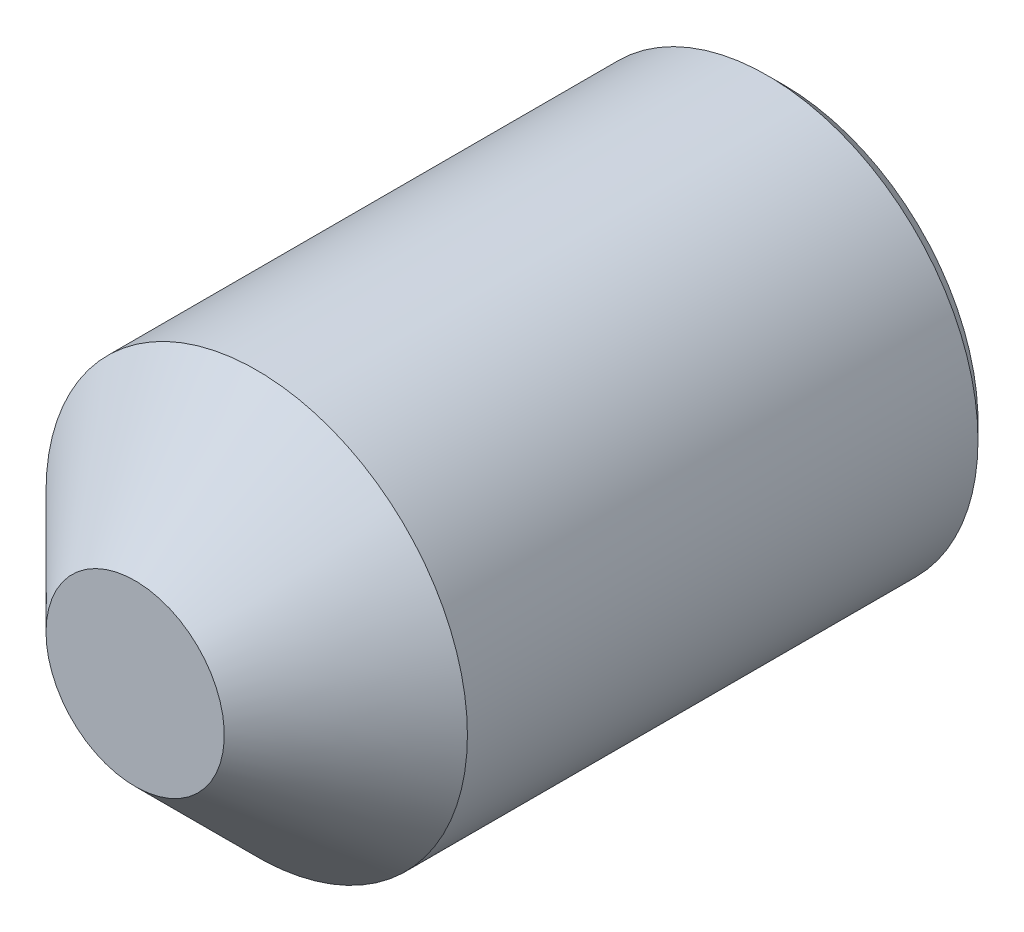
ISO-10303-21;
HEADER;
FILE_DESCRIPTION(('STEP AP214'),'2;1');
FILE_NAME('part.step','',(''),(''),'','','');
FILE_SCHEMA(('AUTOMOTIVE_DESIGN { 1 0 10303 214 1 1 1 1 }'));
ENDSEC;
DATA;
#1=APPLICATION_CONTEXT('core data for automotive mechanical design processes');
#2=APPLICATION_PROTOCOL_DEFINITION('international standard','automotive_design',2000,#1);
#3=PRODUCT_CONTEXT('',#1,'mechanical');
#4=PRODUCT('Part','Part','',(#3));
#5=PRODUCT_RELATED_PRODUCT_CATEGORY('part','',(#4));
#6=PRODUCT_DEFINITION_FORMATION('','',#4);
#7=PRODUCT_DEFINITION_CONTEXT('part definition',#1,'design');
#8=PRODUCT_DEFINITION('design','',#6,#7);
#9=PRODUCT_DEFINITION_SHAPE('','',#8);
#10=(LENGTH_UNIT() NAMED_UNIT(*) SI_UNIT(.MILLI.,.METRE.));
#11=(NAMED_UNIT(*) PLANE_ANGLE_UNIT() SI_UNIT($,.RADIAN.));
#12=(NAMED_UNIT(*) SI_UNIT($,.STERADIAN.) SOLID_ANGLE_UNIT());
#13=UNCERTAINTY_MEASURE_WITH_UNIT(LENGTH_MEASURE(1.E-05),#10,'distance_accuracy_value','');
#14=(GEOMETRIC_REPRESENTATION_CONTEXT(3) GLOBAL_UNCERTAINTY_ASSIGNED_CONTEXT((#13)) GLOBAL_UNIT_ASSIGNED_CONTEXT((#10,
#11,#12)) REPRESENTATION_CONTEXT('',''));
#15=CARTESIAN_POINT('',(0.,0.,0.));
#16=DIRECTION('',(0.,0.,1.));
#17=DIRECTION('',(1.,0.,0.));
#18=AXIS2_PLACEMENT_3D('',#15,#16,#17);
#19=CARTESIAN_POINT('',(-12.9228809173899,-11.1999999999998,-13.0000000074507));
#20=DIRECTION('',(0.,0.,1.));
#21=DIRECTION('',(1.,0.,0.));
#22=AXIS2_PLACEMENT_3D('',#19,#20,#21);
#23=PLANE('',#22);
#24=DIRECTION('',(-0.866025403784439,-0.5,0.));
#25=VECTOR('',#24,1.);
#26=CARTESIAN_POINT('',(-12.9228809173899,-10.3339745962153,-13.0000000074507));
#27=LINE('',#26,#25);
#28=CARTESIAN_POINT('',(-13.6728809173899,-10.7669872981075,-13.0000000074507));
#29=VERTEX_POINT('',#28);
#30=CARTESIAN_POINT('',(-12.9228809173899,-10.3339745962153,-13.0000000074507));
#31=VERTEX_POINT('',#30);
#32=EDGE_CURVE('E71',#29,#31,#27,.F.);
#33=ORIENTED_EDGE('',*,*,#32,.T.);
#34=DIRECTION('',(-0.866025403784439,0.5,0.));
#35=VECTOR('',#34,1.);
#36=CARTESIAN_POINT('',(-12.1728809173899,-10.7669872981075,-13.0000000074507));
#37=LINE('',#36,#35);
#38=CARTESIAN_POINT('',(-12.1728809173899,-10.7669872981075,-13.0000000074507));
#39=VERTEX_POINT('',#38);
#40=EDGE_CURVE('E122',#31,#39,#37,.F.);
#41=ORIENTED_EDGE('',*,*,#40,.T.);
#42=DIRECTION('',(0.,1.,0.));
#43=VECTOR('',#42,1.);
#44=CARTESIAN_POINT('',(-12.1728809173899,-11.633012701892,-13.0000000074507));
#45=LINE('',#44,#43);
#46=CARTESIAN_POINT('',(-12.1728809173899,-11.633012701892,-13.0000000074507));
#47=VERTEX_POINT('',#46);
#48=EDGE_CURVE('E127',#39,#47,#45,.F.);
#49=ORIENTED_EDGE('',*,*,#48,.T.);
#50=DIRECTION('',(0.866025403784439,0.5,0.));
#51=VECTOR('',#50,1.);
#52=CARTESIAN_POINT('',(-12.9228809173899,-12.0660254037842,-13.0000000074507));
#53=LINE('',#52,#51);
#54=CARTESIAN_POINT('',(-12.9228809173899,-12.0660254037842,-13.0000000074507));
#55=VERTEX_POINT('',#54);
#56=EDGE_CURVE('E131',#47,#55,#53,.F.);
#57=ORIENTED_EDGE('',*,*,#56,.T.);
#58=DIRECTION('',(0.866025403784439,-0.5,0.));
#59=VECTOR('',#58,1.);
#60=CARTESIAN_POINT('',(-13.6728809173899,-11.633012701892,-13.0000000074507));
#61=LINE('',#60,#59);
#62=CARTESIAN_POINT('',(-13.6728809173899,-11.633012701892,-13.0000000074507));
#63=VERTEX_POINT('',#62);
#64=EDGE_CURVE('E67',#55,#63,#61,.F.);
#65=ORIENTED_EDGE('',*,*,#64,.T.);
#66=DIRECTION('',(0.,1.,0.));
#67=VECTOR('',#66,1.);
#68=CARTESIAN_POINT('',(-13.6728809173899,-10.7669872981075,-13.0000000074507));
#69=LINE('',#68,#67);
#70=EDGE_CURVE('E69',#63,#29,#69,.T.);
#71=ORIENTED_EDGE('',*,*,#70,.T.);
#72=EDGE_LOOP('',(#33,#41,#49,#57,#65,#71));
#73=FACE_BOUND('',#72,.T.);
#74=ADVANCED_FACE('F16',(#73),#23,.F.);
#75=CARTESIAN_POINT('',(-12.9228809173899,-10.3339745962153,-14.0000000074507));
#76=DIRECTION('',(-0.5,0.866025403784439,0.));
#77=DIRECTION('',(-0.866025403784439,-0.5,0.));
#78=AXIS2_PLACEMENT_3D('',#75,#76,#77);
#79=PLANE('',#78);
#80=DIRECTION('',(0.,0.,1.));
#81=VECTOR('',#80,1.);
#82=CARTESIAN_POINT('',(-12.9228809173899,-10.3339745962153,-14.0000000074507));
#83=LINE('',#82,#81);
#84=CARTESIAN_POINT('',(-12.9228809173899,-10.3339745962153,-14.0000000074507));
#85=VERTEX_POINT('',#84);
#86=EDGE_CURVE('E82',#85,#31,#83,.T.);
#87=ORIENTED_EDGE('',*,*,#86,.T.);
#88=ORIENTED_EDGE('',*,*,#32,.F.);
#89=DIRECTION('',(0.,0.,1.));
#90=VECTOR('',#89,1.);
#91=CARTESIAN_POINT('',(-13.6728809173899,-10.7669872981075,-14.0000000074507));
#92=LINE('',#91,#90);
#93=CARTESIAN_POINT('',(-13.6728809173899,-10.7669872981075,-14.0000000074507));
#94=VERTEX_POINT('',#93);
#95=EDGE_CURVE('E76',#29,#94,#92,.F.);
#96=ORIENTED_EDGE('',*,*,#95,.T.);
#97=DIRECTION('',(-0.866025403784448,-0.499999999999983,0.));
#98=VECTOR('',#97,1.);
#99=CARTESIAN_POINT('',(-12.9228809173899,-10.3339745962153,-14.0000000074507));
#100=LINE('',#99,#98);
#101=EDGE_CURVE('E119',#85,#94,#100,.T.);
#102=ORIENTED_EDGE('',*,*,#101,.F.);
#103=EDGE_LOOP('',(#87,#88,#96,#102));
#104=FACE_BOUND('',#103,.T.);
#105=ADVANCED_FACE('F79',(#104),#79,.F.);
#106=CARTESIAN_POINT('',(-13.6728809173899,-10.7669872981075,-14.0000000074507));
#107=DIRECTION('',(-1.,0.,0.));
#108=DIRECTION('',(0.,0.,1.));
#109=AXIS2_PLACEMENT_3D('',#106,#107,#108);
#110=PLANE('',#109);
#111=ORIENTED_EDGE('',*,*,#95,.F.);
#112=ORIENTED_EDGE('',*,*,#70,.F.);
#113=DIRECTION('',(0.,0.,1.));
#114=VECTOR('',#113,1.);
#115=CARTESIAN_POINT('',(-13.6728809173899,-11.633012701892,-14.0000000074507));
#116=LINE('',#115,#114);
#117=CARTESIAN_POINT('',(-13.6728809173899,-11.633012701892,-14.0000000074507));
#118=VERTEX_POINT('',#117);
#119=EDGE_CURVE('E90',#63,#118,#116,.F.);
#120=ORIENTED_EDGE('',*,*,#119,.T.);
#121=DIRECTION('',(0.,1.,0.));
#122=VECTOR('',#121,1.);
#123=CARTESIAN_POINT('',(-13.6728809173899,-11.1999999999998,-14.0000000074507));
#124=LINE('',#123,#122);
#125=EDGE_CURVE('E87',#94,#118,#124,.F.);
#126=ORIENTED_EDGE('',*,*,#125,.F.);
#127=EDGE_LOOP('',(#111,#112,#120,#126));
#128=FACE_BOUND('',#127,.T.);
#129=ADVANCED_FACE('F85',(#128),#110,.F.);
#130=CARTESIAN_POINT('',(-13.6728809173899,-11.633012701892,-14.0000000074507));
#131=DIRECTION('',(-0.5,-0.866025403784439,0.));
#132=DIRECTION('',(0.866025403784439,-0.5,0.));
#133=AXIS2_PLACEMENT_3D('',#130,#131,#132);
#134=PLANE('',#133);
#135=ORIENTED_EDGE('',*,*,#119,.F.);
#136=ORIENTED_EDGE('',*,*,#64,.F.);
#137=DIRECTION('',(0.,0.,1.));
#138=VECTOR('',#137,1.);
#139=CARTESIAN_POINT('',(-12.9228809173899,-12.0660254037842,-14.0000000074507));
#140=LINE('',#139,#138);
#141=CARTESIAN_POINT('',(-12.9228809173899,-12.0660254037842,-14.0000000074507));
#142=VERTEX_POINT('',#141);
#143=EDGE_CURVE('E129',#55,#142,#140,.F.);
#144=ORIENTED_EDGE('',*,*,#143,.T.);
#145=DIRECTION('',(0.866025403784447,-0.499999999999985,0.));
#146=VECTOR('',#145,1.);
#147=CARTESIAN_POINT('',(-13.6728809173899,-11.633012701892,-14.0000000074507));
#148=LINE('',#147,#146);
#149=EDGE_CURVE('E115',#118,#142,#148,.T.);
#150=ORIENTED_EDGE('',*,*,#149,.F.);
#151=EDGE_LOOP('',(#135,#136,#144,#150));
#152=FACE_BOUND('',#151,.T.);
#153=ADVANCED_FACE('F134',(#152),#134,.F.);
#154=CARTESIAN_POINT('',(-12.9228809173899,-12.0660254037842,-14.0000000074507));
#155=DIRECTION('',(0.5,-0.866025403784439,0.));
#156=DIRECTION('',(0.866025403784439,0.5,0.));
#157=AXIS2_PLACEMENT_3D('',#154,#155,#156);
#158=PLANE('',#157);
#159=ORIENTED_EDGE('',*,*,#143,.F.);
#160=ORIENTED_EDGE('',*,*,#56,.F.);
#161=DIRECTION('',(0.,0.,-1.));
#162=VECTOR('',#161,1.);
#163=CARTESIAN_POINT('',(-12.1728809173899,-11.633012701892,-14.0000000074507));
#164=LINE('',#163,#162);
#165=CARTESIAN_POINT('',(-12.1728809173899,-11.633012701892,-14.0000000074507));
#166=VERTEX_POINT('',#165);
#167=EDGE_CURVE('E125',#47,#166,#164,.T.);
#168=ORIENTED_EDGE('',*,*,#167,.T.);
#169=DIRECTION('',(0.866025403784447,0.499999999999986,0.));
#170=VECTOR('',#169,1.);
#171=CARTESIAN_POINT('',(-12.9228809173899,-12.0660254037842,-14.0000000074507));
#172=LINE('',#171,#170);
#173=EDGE_CURVE('E108',#142,#166,#172,.T.);
#174=ORIENTED_EDGE('',*,*,#173,.F.);
#175=EDGE_LOOP('',(#159,#160,#168,#174));
#176=FACE_BOUND('',#175,.T.);
#177=ADVANCED_FACE('F145',(#176),#158,.F.);
#178=CARTESIAN_POINT('',(-12.1728809173899,-11.633012701892,-14.0000000074507));
#179=DIRECTION('',(1.,0.,0.));
#180=DIRECTION('',(0.,0.,-1.));
#181=AXIS2_PLACEMENT_3D('',#178,#179,#180);
#182=PLANE('',#181);
#183=ORIENTED_EDGE('',*,*,#167,.F.);
#184=ORIENTED_EDGE('',*,*,#48,.F.);
#185=DIRECTION('',(0.,0.,1.));
#186=VECTOR('',#185,1.);
#187=CARTESIAN_POINT('',(-12.1728809173899,-10.7669872981075,-14.0000000074507));
#188=LINE('',#187,#186);
#189=CARTESIAN_POINT('',(-12.1728809173899,-10.7669872981075,-14.0000000074507));
#190=VERTEX_POINT('',#189);
#191=EDGE_CURVE('E34',#39,#190,#188,.F.);
#192=ORIENTED_EDGE('',*,*,#191,.T.);
#193=DIRECTION('',(0.,1.,0.));
#194=VECTOR('',#193,1.);
#195=CARTESIAN_POINT('',(-12.1728809173899,-11.1999999999998,-14.0000000074507));
#196=LINE('',#195,#194);
#197=EDGE_CURVE('E104',#166,#190,#196,.T.);
#198=ORIENTED_EDGE('',*,*,#197,.F.);
#199=EDGE_LOOP('',(#183,#184,#192,#198));
#200=FACE_BOUND('',#199,.T.);
#201=ADVANCED_FACE('F143',(#200),#182,.F.);
#202=CARTESIAN_POINT('',(-12.1728809173899,-10.7669872981075,-14.0000000074507));
#203=DIRECTION('',(0.5,0.866025403784439,0.));
#204=DIRECTION('',(-0.866025403784439,0.5,0.));
#205=AXIS2_PLACEMENT_3D('',#202,#203,#204);
#206=PLANE('',#205);
#207=ORIENTED_EDGE('',*,*,#191,.F.);
#208=ORIENTED_EDGE('',*,*,#40,.F.);
#209=ORIENTED_EDGE('',*,*,#86,.F.);
#210=DIRECTION('',(-0.866025403784448,0.499999999999984,0.));
#211=VECTOR('',#210,1.);
#212=CARTESIAN_POINT('',(-12.1728809173899,-10.7669872981075,-14.0000000074507));
#213=LINE('',#212,#211);
#214=EDGE_CURVE('E100',#190,#85,#213,.T.);
#215=ORIENTED_EDGE('',*,*,#214,.F.);
#216=EDGE_LOOP('',(#207,#208,#209,#215));
#217=FACE_BOUND('',#216,.T.);
#218=ADVANCED_FACE('F140',(#217),#206,.F.);
#219=CARTESIAN_POINT('',(-12.9228809173899,-11.1999999999998,-10.0000000074507));
#220=DIRECTION('',(0.,0.,1.));
#221=DIRECTION('',(1.,0.,0.));
#222=AXIS2_PLACEMENT_3D('',#219,#220,#221);
#223=PLANE('',#222);
#224=CARTESIAN_POINT('',(-12.9228809173899,-11.1999999999998,-10.0000000075259));
#225=DIRECTION('',(0.,0.,-1.));
#226=DIRECTION('',(-1.,0.,0.));
#227=AXIS2_PLACEMENT_3D('',#224,#225,#226);
#228=CIRCLE('',#227,0.550000000089312);
#229=CARTESIAN_POINT('',(-13.4728809174792,-11.1999999999998,-10.0000000075259));
#230=VERTEX_POINT('',#229);
#231=EDGE_CURVE('E19',#230,#230,#228,.T.);
#232=ORIENTED_EDGE('',*,*,#231,.F.);
#233=EDGE_LOOP('',(#232));
#234=FACE_BOUND('',#233,.T.);
#235=ADVANCED_FACE('F173',(#234),#223,.T.);
#236=CARTESIAN_POINT('',(-12.9228809173899,-11.1999999999998,-14.0000000074507));
#237=DIRECTION('',(0.,0.,-1.));
#238=DIRECTION('',(-1.,0.,0.));
#239=AXIS2_PLACEMENT_3D('',#236,#237,#238);
#240=PLANE('',#239);
#241=ORIENTED_EDGE('',*,*,#197,.T.);
#242=ORIENTED_EDGE('',*,*,#214,.T.);
#243=ORIENTED_EDGE('',*,*,#101,.T.);
#244=ORIENTED_EDGE('',*,*,#125,.T.);
#245=ORIENTED_EDGE('',*,*,#149,.T.);
#246=ORIENTED_EDGE('',*,*,#173,.T.);
#247=EDGE_LOOP('',(#241,#242,#243,#244,#245,#246));
#248=FACE_BOUND('',#247,.T.);
#249=CARTESIAN_POINT('',(-12.9228809173899,-11.1999999999998,-14.0000000074249));
#250=DIRECTION('',(0.,0.,1.));
#251=DIRECTION('',(0.,-1.,0.));
#252=AXIS2_PLACEMENT_3D('',#249,#250,#251);
#253=CIRCLE('',#252,1.20000000003984);
#254=CARTESIAN_POINT('',(-12.9228809173899,-12.4000000000396,-14.0000000074249));
#255=VERTEX_POINT('',#254);
#256=EDGE_CURVE('E93',#255,#255,#253,.T.);
#257=ORIENTED_EDGE('',*,*,#256,.F.);
#258=EDGE_LOOP('',(#257));
#259=FACE_BOUND('',#258,.T.);
#260=ADVANCED_FACE('F137',(#248,#259),#240,.T.);
#261=CARTESIAN_POINT('',(-12.9228809173899,-11.1999999999998,-10.7500000074765));
#262=DIRECTION('',(0.,0.,-1.));
#263=DIRECTION('',(-1.,0.,0.));
#264=AXIS2_PLACEMENT_3D('',#261,#262,#263);
#265=CONICAL_SURFACE('',#264,1.30000000003995,0.785398163397448);
#266=CARTESIAN_POINT('',(-12.9228809173899,-11.1999999999998,-10.7500000074507));
#267=DIRECTION('',(0.,0.,1.));
#268=DIRECTION('',(1.,0.,0.));
#269=AXIS2_PLACEMENT_3D('',#266,#267,#268);
#270=CIRCLE('',#269,1.3);
#271=CARTESIAN_POINT('',(-11.6228809173899,-11.1999999999998,-10.7500000074507));
#272=VERTEX_POINT('',#271);
#273=EDGE_CURVE('E25',#272,#272,#270,.F.);
#274=ORIENTED_EDGE('',*,*,#273,.F.);
#275=EDGE_LOOP('',(#274));
#276=FACE_BOUND('',#275,.T.);
#277=ORIENTED_EDGE('',*,*,#231,.T.);
#278=EDGE_LOOP('',(#277));
#279=FACE_BOUND('',#278,.T.);
#280=ADVANCED_FACE('F163',(#276,#279),#265,.T.);
#281=CARTESIAN_POINT('',(-12.9228809173899,-11.1999999999998,-13.9000000074816));
#282=DIRECTION('',(0.,0.,1.));
#283=DIRECTION('',(0.,-1.,0.));
#284=AXIS2_PLACEMENT_3D('',#281,#282,#283);
#285=CONICAL_SURFACE('',#284,1.30000000003995,0.785398163681665);
#286=CARTESIAN_POINT('',(-12.9228809173899,-11.1999999999998,-13.9000000074507));
#287=DIRECTION('',(0.,0.,1.));
#288=DIRECTION('',(1.,0.,0.));
#289=AXIS2_PLACEMENT_3D('',#286,#287,#288);
#290=CIRCLE('',#289,1.3);
#291=CARTESIAN_POINT('',(-11.6228809173899,-11.1999999999998,-13.9000000074507));
#292=VERTEX_POINT('',#291);
#293=EDGE_CURVE('E11',#292,#292,#290,.T.);
#294=ORIENTED_EDGE('',*,*,#293,.F.);
#295=EDGE_LOOP('',(#294));
#296=FACE_BOUND('',#295,.T.);
#297=ORIENTED_EDGE('',*,*,#256,.T.);
#298=EDGE_LOOP('',(#297));
#299=FACE_BOUND('',#298,.T.);
#300=ADVANCED_FACE('F157',(#296,#299),#285,.T.);
#301=CARTESIAN_POINT('',(-12.9228809173899,-11.1999999999998,-12.0000000074507));
#302=DIRECTION('',(0.,0.,1.));
#303=DIRECTION('',(1.,0.,0.));
#304=AXIS2_PLACEMENT_3D('',#301,#302,#303);
#305=CYLINDRICAL_SURFACE('',#304,1.3);
#306=ORIENTED_EDGE('',*,*,#293,.T.);
#307=EDGE_LOOP('',(#306));
#308=FACE_BOUND('',#307,.T.);
#309=ORIENTED_EDGE('',*,*,#273,.T.);
#310=EDGE_LOOP('',(#309));
#311=FACE_BOUND('',#310,.T.);
#312=ADVANCED_FACE('F155',(#308,#311),#305,.T.);
#313=CLOSED_SHELL('',(#74,#105,#129,#153,#177,#201,#218,#235,#260,#280,#300,#312));
#314=MANIFOLD_SOLID_BREP('B1',#313);
#315=ADVANCED_BREP_SHAPE_REPRESENTATION('',(#18,#314),#14);
#316=SHAPE_DEFINITION_REPRESENTATION(#9,#315);
ENDSEC;
END-ISO-10303-21;
